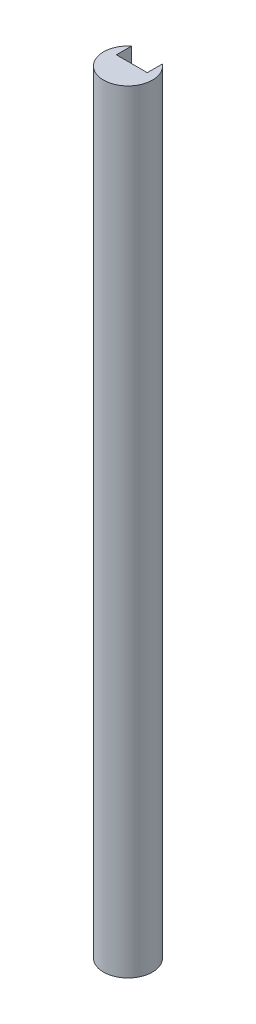
ISO-10303-21;
HEADER;
FILE_DESCRIPTION(('STEP AP214'),'2;1');
FILE_NAME('part.step','',(''),(''),'','','');
FILE_SCHEMA(('AUTOMOTIVE_DESIGN { 1 0 10303 214 1 1 1 1 }'));
ENDSEC;
DATA;
#1=APPLICATION_CONTEXT('core data for automotive mechanical design processes');
#2=APPLICATION_PROTOCOL_DEFINITION('international standard','automotive_design',2000,#1);
#3=PRODUCT_CONTEXT('',#1,'mechanical');
#4=PRODUCT('Part','Part','',(#3));
#5=PRODUCT_RELATED_PRODUCT_CATEGORY('part','',(#4));
#6=PRODUCT_DEFINITION_FORMATION('','',#4);
#7=PRODUCT_DEFINITION_CONTEXT('part definition',#1,'design');
#8=PRODUCT_DEFINITION('design','',#6,#7);
#9=PRODUCT_DEFINITION_SHAPE('','',#8);
#10=(LENGTH_UNIT() NAMED_UNIT(*) SI_UNIT(.MILLI.,.METRE.));
#11=(NAMED_UNIT(*) PLANE_ANGLE_UNIT() SI_UNIT($,.RADIAN.));
#12=(NAMED_UNIT(*) SI_UNIT($,.STERADIAN.) SOLID_ANGLE_UNIT());
#13=UNCERTAINTY_MEASURE_WITH_UNIT(LENGTH_MEASURE(1.E-05),#10,'distance_accuracy_value','');
#14=(GEOMETRIC_REPRESENTATION_CONTEXT(3) GLOBAL_UNCERTAINTY_ASSIGNED_CONTEXT((#13)) GLOBAL_UNIT_ASSIGNED_CONTEXT((#10,
#11,#12)) REPRESENTATION_CONTEXT('',''));
#15=CARTESIAN_POINT('',(0.,0.,0.));
#16=DIRECTION('',(0.,0.,1.));
#17=DIRECTION('',(1.,0.,0.));
#18=AXIS2_PLACEMENT_3D('',#15,#16,#17);
#19=CARTESIAN_POINT('',(-1.524,76.2,-1.87082682255734));
#20=DIRECTION('',(1.,0.,0.));
#21=DIRECTION('',(0.,0.,-1.));
#22=AXIS2_PLACEMENT_3D('',#19,#20,#21);
#23=PLANE('',#22);
#24=DIRECTION('',(0.,0.,1.));
#25=VECTOR('',#24,1.);
#26=CARTESIAN_POINT('',(-1.524,0.,-1.87082682255734));
#27=LINE('',#26,#25);
#28=CARTESIAN_POINT('',(-1.524,0.,-1.87082682255734));
#29=VERTEX_POINT('',#28);
#30=CARTESIAN_POINT('',(-1.524,0.,-0.381));
#31=VERTEX_POINT('',#30);
#32=EDGE_CURVE('E102',#29,#31,#27,.T.);
#33=ORIENTED_EDGE('',*,*,#32,.F.);
#34=DIRECTION('',(0.,-1.,0.));
#35=VECTOR('',#34,1.);
#36=CARTESIAN_POINT('',(-1.524,76.2,-1.87082682255734));
#37=LINE('',#36,#35);
#38=CARTESIAN_POINT('',(-1.524,76.2,-1.87082682255734));
#39=VERTEX_POINT('',#38);
#40=EDGE_CURVE('E11',#39,#29,#37,.T.);
#41=ORIENTED_EDGE('',*,*,#40,.F.);
#42=DIRECTION('',(0.,0.,1.));
#43=VECTOR('',#42,1.);
#44=CARTESIAN_POINT('',(-1.524,76.2,-1.87082682255734));
#45=LINE('',#44,#43);
#46=CARTESIAN_POINT('',(-1.524,76.2,-0.381));
#47=VERTEX_POINT('',#46);
#48=EDGE_CURVE('E97',#39,#47,#45,.T.);
#49=ORIENTED_EDGE('',*,*,#48,.T.);
#50=DIRECTION('',(0.,-1.,0.));
#51=VECTOR('',#50,1.);
#52=CARTESIAN_POINT('',(-1.524,76.2,-0.381));
#53=LINE('',#52,#51);
#54=EDGE_CURVE('E40',#47,#31,#53,.T.);
#55=ORIENTED_EDGE('',*,*,#54,.T.);
#56=EDGE_LOOP('',(#33,#41,#49,#55));
#57=FACE_BOUND('',#56,.T.);
#58=ADVANCED_FACE('F37',(#57),#23,.T.);
#59=CARTESIAN_POINT('',(0.,76.2,0.));
#60=DIRECTION('',(0.,-1.,0.));
#61=DIRECTION('',(0.,0.,-1.));
#62=AXIS2_PLACEMENT_3D('',#59,#60,#61);
#63=CYLINDRICAL_SURFACE('',#62,2.413);
#64=CARTESIAN_POINT('',(0.,0.,0.));
#65=DIRECTION('',(0.,1.,0.));
#66=DIRECTION('',(0.,0.,1.));
#67=AXIS2_PLACEMENT_3D('',#64,#65,#66);
#68=CIRCLE('',#67,2.413);
#69=CARTESIAN_POINT('',(1.524,0.,-1.87082682255734));
#70=VERTEX_POINT('',#69);
#71=EDGE_CURVE('E70',#29,#70,#68,.T.);
#72=ORIENTED_EDGE('',*,*,#71,.T.);
#73=DIRECTION('',(0.,-1.,0.));
#74=VECTOR('',#73,1.);
#75=CARTESIAN_POINT('',(1.524,76.2,-1.87082682255734));
#76=LINE('',#75,#74);
#77=CARTESIAN_POINT('',(1.524,76.2,-1.87082682255734));
#78=VERTEX_POINT('',#77);
#79=EDGE_CURVE('E46',#78,#70,#76,.T.);
#80=ORIENTED_EDGE('',*,*,#79,.F.);
#81=CARTESIAN_POINT('',(0.,76.2,0.));
#82=DIRECTION('',(0.,1.,0.));
#83=DIRECTION('',(0.,0.,1.));
#84=AXIS2_PLACEMENT_3D('',#81,#82,#83);
#85=CIRCLE('',#84,2.413);
#86=EDGE_CURVE('E87',#39,#78,#85,.T.);
#87=ORIENTED_EDGE('',*,*,#86,.F.);
#88=ORIENTED_EDGE('',*,*,#40,.T.);
#89=EDGE_LOOP('',(#72,#80,#87,#88));
#90=FACE_BOUND('',#89,.T.);
#91=ADVANCED_FACE('F112',(#90),#63,.T.);
#92=CARTESIAN_POINT('',(1.524,76.2,-1.87082682255734));
#93=DIRECTION('',(1.,0.,0.));
#94=DIRECTION('',(0.,0.,-1.));
#95=AXIS2_PLACEMENT_3D('',#92,#93,#94);
#96=PLANE('',#95);
#97=DIRECTION('',(0.,0.,1.));
#98=VECTOR('',#97,1.);
#99=CARTESIAN_POINT('',(1.524,0.,-1.87082682255734));
#100=LINE('',#99,#98);
#101=CARTESIAN_POINT('',(1.524,0.,-0.381));
#102=VERTEX_POINT('',#101);
#103=EDGE_CURVE('E94',#70,#102,#100,.T.);
#104=ORIENTED_EDGE('',*,*,#103,.T.);
#105=DIRECTION('',(0.,-1.,0.));
#106=VECTOR('',#105,1.);
#107=CARTESIAN_POINT('',(1.524,76.2,-0.381));
#108=LINE('',#107,#106);
#109=CARTESIAN_POINT('',(1.524,76.2,-0.381));
#110=VERTEX_POINT('',#109);
#111=EDGE_CURVE('E91',#110,#102,#108,.T.);
#112=ORIENTED_EDGE('',*,*,#111,.F.);
#113=DIRECTION('',(0.,0.,1.));
#114=VECTOR('',#113,1.);
#115=CARTESIAN_POINT('',(1.524,76.2,-1.87082682255734));
#116=LINE('',#115,#114);
#117=EDGE_CURVE('E82',#78,#110,#116,.T.);
#118=ORIENTED_EDGE('',*,*,#117,.F.);
#119=ORIENTED_EDGE('',*,*,#79,.T.);
#120=EDGE_LOOP('',(#104,#112,#118,#119));
#121=FACE_BOUND('',#120,.T.);
#122=ADVANCED_FACE('F92',(#121),#96,.F.);
#123=CARTESIAN_POINT('',(-1.524,76.2,-0.381));
#124=DIRECTION('',(0.,0.,-1.));
#125=DIRECTION('',(-1.,0.,0.));
#126=AXIS2_PLACEMENT_3D('',#123,#124,#125);
#127=PLANE('',#126);
#128=DIRECTION('',(1.,0.,0.));
#129=VECTOR('',#128,1.);
#130=CARTESIAN_POINT('',(-1.524,0.,-0.381));
#131=LINE('',#130,#129);
#132=EDGE_CURVE('E105',#31,#102,#131,.T.);
#133=ORIENTED_EDGE('',*,*,#132,.F.);
#134=ORIENTED_EDGE('',*,*,#54,.F.);
#135=DIRECTION('',(1.,0.,0.));
#136=VECTOR('',#135,1.);
#137=CARTESIAN_POINT('',(-1.524,76.2,-0.381));
#138=LINE('',#137,#136);
#139=EDGE_CURVE('E86',#47,#110,#138,.T.);
#140=ORIENTED_EDGE('',*,*,#139,.T.);
#141=ORIENTED_EDGE('',*,*,#111,.T.);
#142=EDGE_LOOP('',(#133,#134,#140,#141));
#143=FACE_BOUND('',#142,.T.);
#144=ADVANCED_FACE('F96',(#143),#127,.T.);
#145=CARTESIAN_POINT('',(0.,76.2,0.));
#146=DIRECTION('',(0.,1.,0.));
#147=DIRECTION('',(0.,0.,1.));
#148=AXIS2_PLACEMENT_3D('',#145,#146,#147);
#149=PLANE('',#148);
#150=ORIENTED_EDGE('',*,*,#48,.F.);
#151=ORIENTED_EDGE('',*,*,#86,.T.);
#152=ORIENTED_EDGE('',*,*,#117,.T.);
#153=ORIENTED_EDGE('',*,*,#139,.F.);
#154=EDGE_LOOP('',(#150,#151,#152,#153));
#155=FACE_BOUND('',#154,.T.);
#156=ADVANCED_FACE('F85',(#155),#149,.T.);
#157=CARTESIAN_POINT('',(0.,0.,0.));
#158=DIRECTION('',(0.,1.,0.));
#159=DIRECTION('',(0.,0.,1.));
#160=AXIS2_PLACEMENT_3D('',#157,#158,#159);
#161=PLANE('',#160);
#162=ORIENTED_EDGE('',*,*,#32,.T.);
#163=ORIENTED_EDGE('',*,*,#132,.T.);
#164=ORIENTED_EDGE('',*,*,#103,.F.);
#165=ORIENTED_EDGE('',*,*,#71,.F.);
#166=EDGE_LOOP('',(#162,#163,#164,#165));
#167=FACE_BOUND('',#166,.T.);
#168=ADVANCED_FACE('F110',(#167),#161,.F.);
#169=CLOSED_SHELL('',(#58,#91,#122,#144,#156,#168));
#170=MANIFOLD_SOLID_BREP('B2',#169);
#171=ADVANCED_BREP_SHAPE_REPRESENTATION('',(#18,#170),#14);
#172=SHAPE_DEFINITION_REPRESENTATION(#9,#171);
ENDSEC;
END-ISO-10303-21;
